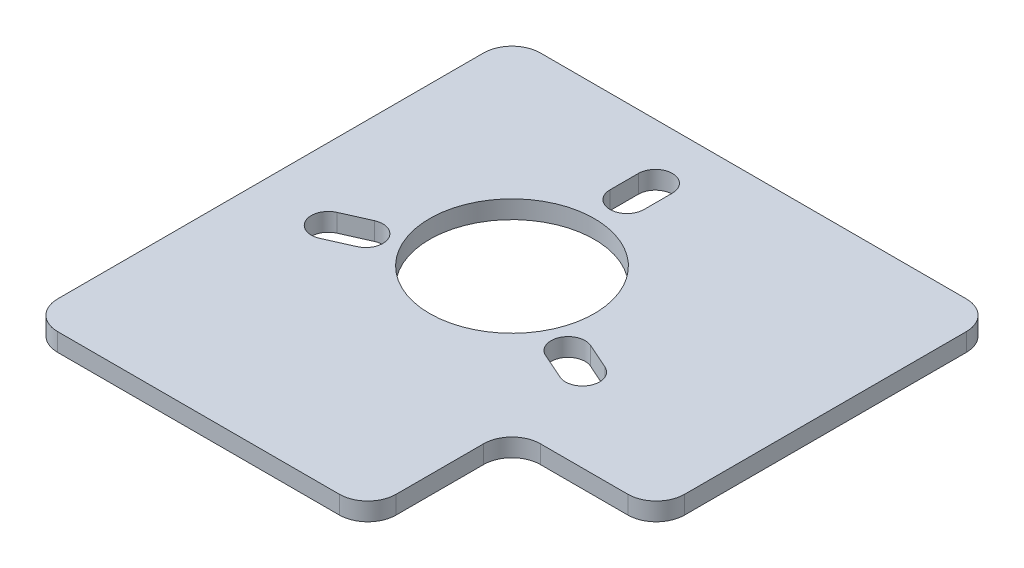
ISO-10303-21;
HEADER;
FILE_DESCRIPTION(('STEP AP214'),'2;1');
FILE_NAME('part.step','',(''),(''),'','','');
FILE_SCHEMA(('AUTOMOTIVE_DESIGN { 1 0 10303 214 1 1 1 1 }'));
ENDSEC;
DATA;
#1=APPLICATION_CONTEXT('core data for automotive mechanical design processes');
#2=APPLICATION_PROTOCOL_DEFINITION('international standard','automotive_design',2000,#1);
#3=PRODUCT_CONTEXT('',#1,'mechanical');
#4=PRODUCT('Part','Part','',(#3));
#5=PRODUCT_RELATED_PRODUCT_CATEGORY('part','',(#4));
#6=PRODUCT_DEFINITION_FORMATION('','',#4);
#7=PRODUCT_DEFINITION_CONTEXT('part definition',#1,'design');
#8=PRODUCT_DEFINITION('design','',#6,#7);
#9=PRODUCT_DEFINITION_SHAPE('','',#8);
#10=(LENGTH_UNIT() NAMED_UNIT(*) SI_UNIT(.MILLI.,.METRE.));
#11=(NAMED_UNIT(*) PLANE_ANGLE_UNIT() SI_UNIT($,.RADIAN.));
#12=(NAMED_UNIT(*) SI_UNIT($,.STERADIAN.) SOLID_ANGLE_UNIT());
#13=UNCERTAINTY_MEASURE_WITH_UNIT(LENGTH_MEASURE(1.E-05),#10,'distance_accuracy_value','');
#14=(GEOMETRIC_REPRESENTATION_CONTEXT(3) GLOBAL_UNCERTAINTY_ASSIGNED_CONTEXT((#13)) GLOBAL_UNIT_ASSIGNED_CONTEXT((#10,
#11,#12)) REPRESENTATION_CONTEXT('',''));
#15=CARTESIAN_POINT('',(0.,0.,0.));
#16=DIRECTION('',(0.,0.,1.));
#17=DIRECTION('',(1.,0.,0.));
#18=AXIS2_PLACEMENT_3D('',#15,#16,#17);
#19=CARTESIAN_POINT('',(0.,6.35,0.));
#20=DIRECTION('',(0.,-1.,0.));
#21=DIRECTION('',(0.,0.,-1.));
#22=AXIS2_PLACEMENT_3D('',#19,#20,#21);
#23=PLANE('',#22);
#24=DIRECTION('',(0.913545457642603,0.,-0.406736643075796));
#25=VECTOR('',#24,1.);
#26=CARTESIAN_POINT('',(27.6766924339672,6.35,-74.5886317434304));
#27=LINE('',#26,#25);
#28=CARTESIAN_POINT('',(27.6766924339672,6.35,-74.5886317434304));
#29=VERTEX_POINT('',#28);
#30=CARTESIAN_POINT('',(36.8121470103933,6.35,-78.6559981741884));
#31=VERTEX_POINT('',#30);
#32=EDGE_CURVE('E243',#29,#31,#27,.T.);
#33=ORIENTED_EDGE('',*,*,#32,.F.);
#34=CARTESIAN_POINT('',(25.2362725755124,6.35,-80.0699044892861));
#35=DIRECTION('',(0.,1.,0.));
#36=DIRECTION('',(0.,0.,1.));
#37=AXIS2_PLACEMENT_3D('',#34,#35,#36);
#38=CIRCLE('',#37,6.);
#39=CARTESIAN_POINT('',(22.7958527170577,6.35,-85.5511772351417));
#40=VERTEX_POINT('',#39);
#41=EDGE_CURVE('E61',#40,#29,#38,.T.);
#42=ORIENTED_EDGE('',*,*,#41,.F.);
#43=DIRECTION('',(-0.913545457642604,0.,0.406736643075794));
#44=VECTOR('',#43,1.);
#45=CARTESIAN_POINT('',(22.7958527170577,6.35,-85.5511772351417));
#46=LINE('',#45,#44);
#47=CARTESIAN_POINT('',(31.9313072934837,6.35,-89.6185436658996));
#48=VERTEX_POINT('',#47);
#49=EDGE_CURVE('E230',#48,#40,#46,.T.);
#50=ORIENTED_EDGE('',*,*,#49,.F.);
#51=CARTESIAN_POINT('',(34.3717271519385,6.35,-84.137270920044));
#52=DIRECTION('',(0.,1.,0.));
#53=DIRECTION('',(0.,0.,1.));
#54=AXIS2_PLACEMENT_3D('',#51,#52,#53);
#55=CIRCLE('',#54,6.);
#56=EDGE_CURVE('E234',#31,#48,#55,.T.);
#57=ORIENTED_EDGE('',*,*,#56,.F.);
#58=EDGE_LOOP('',(#33,#42,#50,#57));
#59=FACE_BOUND('',#58,.T.);
#60=DIRECTION('',(-0.9135454576426,0.,-0.406736643075802));
#61=VECTOR('',#60,1.);
#62=CARTESIAN_POINT('',(117.204147282942,6.35,-85.5511772351414));
#63=LINE('',#62,#61);
#64=CARTESIAN_POINT('',(117.204147282942,6.35,-85.5511772351414));
#65=VERTEX_POINT('',#64);
#66=CARTESIAN_POINT('',(108.068692706516,6.35,-89.6185436658994));
#67=VERTEX_POINT('',#66);
#68=EDGE_CURVE('E281',#65,#67,#63,.T.);
#69=ORIENTED_EDGE('',*,*,#68,.F.);
#70=CARTESIAN_POINT('',(114.763727424487,6.35,-80.0699044892857));
#71=DIRECTION('',(0.,1.,0.));
#72=DIRECTION('',(0.,0.,1.));
#73=AXIS2_PLACEMENT_3D('',#70,#71,#72);
#74=CIRCLE('',#73,6.00000000000002);
#75=CARTESIAN_POINT('',(112.323307566033,6.35,-74.5886317434301));
#76=VERTEX_POINT('',#75);
#77=EDGE_CURVE('E69',#76,#65,#74,.T.);
#78=ORIENTED_EDGE('',*,*,#77,.F.);
#79=DIRECTION('',(0.9135454576426,0.,0.406736643075802));
#80=VECTOR('',#79,1.);
#81=CARTESIAN_POINT('',(112.323307566033,6.35,-74.5886317434301));
#82=LINE('',#81,#80);
#83=CARTESIAN_POINT('',(103.187852989607,6.35,-78.6559981741882));
#84=VERTEX_POINT('',#83);
#85=EDGE_CURVE('E272',#84,#76,#82,.T.);
#86=ORIENTED_EDGE('',*,*,#85,.F.);
#87=CARTESIAN_POINT('',(105.628272848061,6.35,-84.1372709200438));
#88=DIRECTION('',(0.,1.,0.));
#89=DIRECTION('',(0.,0.,1.));
#90=AXIS2_PLACEMENT_3D('',#87,#88,#89);
#91=CIRCLE('',#90,6.00000000000002);
#92=EDGE_CURVE('E276',#67,#84,#91,.T.);
#93=ORIENTED_EDGE('',*,*,#92,.F.);
#94=EDGE_LOOP('',(#69,#78,#86,#93));
#95=FACE_BOUND('',#94,.T.);
#96=DIRECTION('',(0.,0.,1.));
#97=VECTOR('',#96,1.);
#98=CARTESIAN_POINT('',(64.,6.35,-150.5));
#99=LINE('',#98,#97);
#100=CARTESIAN_POINT('',(64.,6.35,-150.5));
#101=VERTEX_POINT('',#100);
#102=CARTESIAN_POINT('',(64.,6.35,-140.5));
#103=VERTEX_POINT('',#102);
#104=EDGE_CURVE('E324',#101,#103,#99,.T.);
#105=ORIENTED_EDGE('',*,*,#104,.F.);
#106=CARTESIAN_POINT('',(70.,6.35,-150.5));
#107=DIRECTION('',(0.,1.,0.));
#108=DIRECTION('',(0.,0.,1.));
#109=AXIS2_PLACEMENT_3D('',#106,#107,#108);
#110=CIRCLE('',#109,6.00000000000001);
#111=CARTESIAN_POINT('',(76.,6.35,-150.5));
#112=VERTEX_POINT('',#111);
#113=EDGE_CURVE('E271',#112,#101,#110,.T.);
#114=ORIENTED_EDGE('',*,*,#113,.F.);
#115=DIRECTION('',(0.,0.,-1.));
#116=VECTOR('',#115,1.);
#117=CARTESIAN_POINT('',(76.,6.35,-150.5));
#118=LINE('',#117,#116);
#119=CARTESIAN_POINT('',(76.,6.35,-140.5));
#120=VERTEX_POINT('',#119);
#121=EDGE_CURVE('E315',#120,#112,#118,.T.);
#122=ORIENTED_EDGE('',*,*,#121,.F.);
#123=CARTESIAN_POINT('',(70.,6.35,-140.5));
#124=DIRECTION('',(0.,1.,0.));
#125=DIRECTION('',(0.,0.,1.));
#126=AXIS2_PLACEMENT_3D('',#123,#124,#125);
#127=CIRCLE('',#126,6.00000000000001);
#128=EDGE_CURVE('E319',#103,#120,#127,.T.);
#129=ORIENTED_EDGE('',*,*,#128,.F.);
#130=EDGE_LOOP('',(#105,#114,#122,#129));
#131=FACE_BOUND('',#130,.T.);
#132=DIRECTION('',(0.,0.,1.));
#133=VECTOR('',#132,1.);
#134=CARTESIAN_POINT('',(0.,6.35,0.));
#135=LINE('',#134,#133);
#136=CARTESIAN_POINT('',(0.,6.35,-160.));
#137=VERTEX_POINT('',#136);
#138=CARTESIAN_POINT('',(0.,6.35,-10.));
#139=VERTEX_POINT('',#138);
#140=EDGE_CURVE('E368',#137,#139,#135,.T.);
#141=ORIENTED_EDGE('',*,*,#140,.T.);
#142=CARTESIAN_POINT('',(10.,6.35,-10.));
#143=DIRECTION('',(0.,-1.,0.));
#144=DIRECTION('',(0.,0.,-1.));
#145=AXIS2_PLACEMENT_3D('',#142,#143,#144);
#146=CIRCLE('',#145,10.);
#147=CARTESIAN_POINT('',(10.,6.35,0.));
#148=VERTEX_POINT('',#147);
#149=EDGE_CURVE('E441',#139,#148,#146,.F.);
#150=ORIENTED_EDGE('',*,*,#149,.T.);
#151=DIRECTION('',(1.,0.,0.));
#152=VECTOR('',#151,1.);
#153=CARTESIAN_POINT('',(0.,6.35,0.));
#154=LINE('',#153,#152);
#155=CARTESIAN_POINT('',(109.2,6.35,0.));
#156=VERTEX_POINT('',#155);
#157=EDGE_CURVE('E372',#148,#156,#154,.T.);
#158=ORIENTED_EDGE('',*,*,#157,.T.);
#159=CARTESIAN_POINT('',(109.2,6.35,-10.));
#160=DIRECTION('',(0.,-1.,0.));
#161=DIRECTION('',(0.,0.,-1.));
#162=AXIS2_PLACEMENT_3D('',#159,#160,#161);
#163=CIRCLE('',#162,10.);
#164=CARTESIAN_POINT('',(119.2,6.35,-10.));
#165=VERTEX_POINT('',#164);
#166=EDGE_CURVE('E438',#156,#165,#163,.F.);
#167=ORIENTED_EDGE('',*,*,#166,.T.);
#168=DIRECTION('',(0.,0.,1.));
#169=VECTOR('',#168,1.);
#170=CARTESIAN_POINT('',(119.2,6.35,0.));
#171=LINE('',#170,#169);
#172=CARTESIAN_POINT('',(119.2,6.35,-40.8));
#173=VERTEX_POINT('',#172);
#174=EDGE_CURVE('E252',#173,#165,#171,.T.);
#175=ORIENTED_EDGE('',*,*,#174,.F.);
#176=CARTESIAN_POINT('',(129.2,6.35,-40.8));
#177=DIRECTION('',(0.,-1.,0.));
#178=DIRECTION('',(0.,0.,-1.));
#179=AXIS2_PLACEMENT_3D('',#176,#177,#178);
#180=CIRCLE('',#179,10.);
#181=CARTESIAN_POINT('',(129.2,6.35,-50.8));
#182=VERTEX_POINT('',#181);
#183=EDGE_CURVE('E54',#173,#182,#180,.T.);
#184=ORIENTED_EDGE('',*,*,#183,.T.);
#185=DIRECTION('',(-1.,0.,0.));
#186=VECTOR('',#185,1.);
#187=CARTESIAN_POINT('',(119.2,6.35,-50.8));
#188=LINE('',#187,#186);
#189=CARTESIAN_POINT('',(160.,6.35,-50.8));
#190=VERTEX_POINT('',#189);
#191=EDGE_CURVE('E349',#190,#182,#188,.T.);
#192=ORIENTED_EDGE('',*,*,#191,.F.);
#193=CARTESIAN_POINT('',(160.,6.35,-60.8));
#194=DIRECTION('',(0.,-1.,0.));
#195=DIRECTION('',(0.,0.,-1.));
#196=AXIS2_PLACEMENT_3D('',#193,#194,#195);
#197=CIRCLE('',#196,10.);
#198=CARTESIAN_POINT('',(170.,6.35,-60.8));
#199=VERTEX_POINT('',#198);
#200=EDGE_CURVE('E435',#190,#199,#197,.F.);
#201=ORIENTED_EDGE('',*,*,#200,.T.);
#202=DIRECTION('',(0.,0.,-1.));
#203=VECTOR('',#202,1.);
#204=CARTESIAN_POINT('',(170.,6.35,0.));
#205=LINE('',#204,#203);
#206=CARTESIAN_POINT('',(170.,6.35,-160.));
#207=VERTEX_POINT('',#206);
#208=EDGE_CURVE('E377',#199,#207,#205,.T.);
#209=ORIENTED_EDGE('',*,*,#208,.T.);
#210=CARTESIAN_POINT('',(160.,6.35,-160.));
#211=DIRECTION('',(0.,-1.,0.));
#212=DIRECTION('',(0.,0.,-1.));
#213=AXIS2_PLACEMENT_3D('',#210,#211,#212);
#214=CIRCLE('',#213,10.);
#215=CARTESIAN_POINT('',(160.,6.35,-170.));
#216=VERTEX_POINT('',#215);
#217=EDGE_CURVE('E432',#207,#216,#214,.F.);
#218=ORIENTED_EDGE('',*,*,#217,.T.);
#219=DIRECTION('',(-1.,0.,0.));
#220=VECTOR('',#219,1.);
#221=CARTESIAN_POINT('',(0.,6.35,-170.));
#222=LINE('',#221,#220);
#223=CARTESIAN_POINT('',(10.,6.35,-170.));
#224=VERTEX_POINT('',#223);
#225=EDGE_CURVE('E381',#216,#224,#222,.T.);
#226=ORIENTED_EDGE('',*,*,#225,.T.);
#227=CARTESIAN_POINT('',(10.,6.35,-160.));
#228=DIRECTION('',(0.,-1.,0.));
#229=DIRECTION('',(0.,0.,-1.));
#230=AXIS2_PLACEMENT_3D('',#227,#228,#229);
#231=CIRCLE('',#230,10.);
#232=EDGE_CURVE('E429',#224,#137,#231,.F.);
#233=ORIENTED_EDGE('',*,*,#232,.T.);
#234=EDGE_LOOP('',(#141,#150,#158,#167,#175,#184,#192,#201,#209,#218,#226,#233));
#235=FACE_BOUND('',#234,.T.);
#236=CARTESIAN_POINT('',(70.,6.35,-100.));
#237=DIRECTION('',(0.,1.,0.));
#238=DIRECTION('',(0.,0.,1.));
#239=AXIS2_PLACEMENT_3D('',#236,#237,#238);
#240=CIRCLE('',#239,29.);
#241=CARTESIAN_POINT('',(70.,6.35,-71.));
#242=VERTEX_POINT('',#241);
#243=EDGE_CURVE('E360',#242,#242,#240,.T.);
#244=ORIENTED_EDGE('',*,*,#243,.F.);
#245=EDGE_LOOP('',(#244));
#246=FACE_BOUND('',#245,.T.);
#247=ADVANCED_FACE('F45',(#59,#95,#131,#235,#246),#23,.F.);
#248=CARTESIAN_POINT('',(0.,0.,0.));
#249=DIRECTION('',(0.,-1.,0.));
#250=DIRECTION('',(0.,0.,-1.));
#251=AXIS2_PLACEMENT_3D('',#248,#249,#250);
#252=PLANE('',#251);
#253=CARTESIAN_POINT('',(25.2362725755124,0.,-80.0699044892861));
#254=DIRECTION('',(0.,1.,0.));
#255=DIRECTION('',(0.,0.,1.));
#256=AXIS2_PLACEMENT_3D('',#253,#254,#255);
#257=CIRCLE('',#256,6.);
#258=CARTESIAN_POINT('',(22.7958527170577,0.,-85.5511772351417));
#259=VERTEX_POINT('',#258);
#260=CARTESIAN_POINT('',(27.6766924339672,0.,-74.5886317434304));
#261=VERTEX_POINT('',#260);
#262=EDGE_CURVE('E208',#259,#261,#257,.T.);
#263=ORIENTED_EDGE('',*,*,#262,.T.);
#264=DIRECTION('',(0.913545457642603,0.,-0.406736643075796));
#265=VECTOR('',#264,1.);
#266=CARTESIAN_POINT('',(27.6766924339672,0.,-74.5886317434304));
#267=LINE('',#266,#265);
#268=CARTESIAN_POINT('',(36.8121470103933,0.,-78.6559981741884));
#269=VERTEX_POINT('',#268);
#270=EDGE_CURVE('E219',#261,#269,#267,.T.);
#271=ORIENTED_EDGE('',*,*,#270,.T.);
#272=CARTESIAN_POINT('',(34.3717271519385,0.,-84.137270920044));
#273=DIRECTION('',(0.,1.,0.));
#274=DIRECTION('',(0.,0.,1.));
#275=AXIS2_PLACEMENT_3D('',#272,#273,#274);
#276=CIRCLE('',#275,6.);
#277=CARTESIAN_POINT('',(31.9313072934837,0.,-89.6185436658996));
#278=VERTEX_POINT('',#277);
#279=EDGE_CURVE('E224',#269,#278,#276,.T.);
#280=ORIENTED_EDGE('',*,*,#279,.T.);
#281=DIRECTION('',(-0.913545457642604,0.,0.406736643075794));
#282=VECTOR('',#281,1.);
#283=CARTESIAN_POINT('',(22.7958527170577,0.,-85.5511772351417));
#284=LINE('',#283,#282);
#285=EDGE_CURVE('E215',#278,#259,#284,.T.);
#286=ORIENTED_EDGE('',*,*,#285,.T.);
#287=EDGE_LOOP('',(#263,#271,#280,#286));
#288=FACE_BOUND('',#287,.T.);
#289=CARTESIAN_POINT('',(114.763727424487,0.,-80.0699044892857));
#290=DIRECTION('',(0.,1.,0.));
#291=DIRECTION('',(0.,0.,1.));
#292=AXIS2_PLACEMENT_3D('',#289,#290,#291);
#293=CIRCLE('',#292,6.00000000000002);
#294=CARTESIAN_POINT('',(112.323307566033,0.,-74.5886317434301));
#295=VERTEX_POINT('',#294);
#296=CARTESIAN_POINT('',(117.204147282942,0.,-85.5511772351414));
#297=VERTEX_POINT('',#296);
#298=EDGE_CURVE('E277',#295,#297,#293,.T.);
#299=ORIENTED_EDGE('',*,*,#298,.T.);
#300=DIRECTION('',(-0.9135454576426,0.,-0.406736643075802));
#301=VECTOR('',#300,1.);
#302=CARTESIAN_POINT('',(117.204147282942,0.,-85.5511772351414));
#303=LINE('',#302,#301);
#304=CARTESIAN_POINT('',(108.068692706516,0.,-89.6185436658994));
#305=VERTEX_POINT('',#304);
#306=EDGE_CURVE('E294',#297,#305,#303,.T.);
#307=ORIENTED_EDGE('',*,*,#306,.T.);
#308=CARTESIAN_POINT('',(105.628272848061,0.,-84.1372709200438));
#309=DIRECTION('',(0.,1.,0.));
#310=DIRECTION('',(0.,0.,1.));
#311=AXIS2_PLACEMENT_3D('',#308,#309,#310);
#312=CIRCLE('',#311,6.00000000000002);
#313=CARTESIAN_POINT('',(103.187852989607,0.,-78.6559981741882));
#314=VERTEX_POINT('',#313);
#315=EDGE_CURVE('E290',#305,#314,#312,.T.);
#316=ORIENTED_EDGE('',*,*,#315,.T.);
#317=DIRECTION('',(0.9135454576426,0.,0.406736643075802));
#318=VECTOR('',#317,1.);
#319=CARTESIAN_POINT('',(112.323307566033,0.,-74.5886317434301));
#320=LINE('',#319,#318);
#321=EDGE_CURVE('E261',#314,#295,#320,.T.);
#322=ORIENTED_EDGE('',*,*,#321,.T.);
#323=EDGE_LOOP('',(#299,#307,#316,#322));
#324=FACE_BOUND('',#323,.T.);
#325=CARTESIAN_POINT('',(70.,0.,-150.5));
#326=DIRECTION('',(0.,1.,0.));
#327=DIRECTION('',(0.,0.,1.));
#328=AXIS2_PLACEMENT_3D('',#325,#326,#327);
#329=CIRCLE('',#328,6.00000000000001);
#330=CARTESIAN_POINT('',(76.,0.,-150.5));
#331=VERTEX_POINT('',#330);
#332=CARTESIAN_POINT('',(64.,0.,-150.5));
#333=VERTEX_POINT('',#332);
#334=EDGE_CURVE('E320',#331,#333,#329,.T.);
#335=ORIENTED_EDGE('',*,*,#334,.T.);
#336=DIRECTION('',(0.,0.,1.));
#337=VECTOR('',#336,1.);
#338=CARTESIAN_POINT('',(64.,0.,-150.5));
#339=LINE('',#338,#337);
#340=CARTESIAN_POINT('',(64.,0.,-140.5));
#341=VERTEX_POINT('',#340);
#342=EDGE_CURVE('E337',#333,#341,#339,.T.);
#343=ORIENTED_EDGE('',*,*,#342,.T.);
#344=CARTESIAN_POINT('',(70.,0.,-140.5));
#345=DIRECTION('',(0.,1.,0.));
#346=DIRECTION('',(0.,0.,1.));
#347=AXIS2_PLACEMENT_3D('',#344,#345,#346);
#348=CIRCLE('',#347,6.00000000000001);
#349=CARTESIAN_POINT('',(76.,0.,-140.5));
#350=VERTEX_POINT('',#349);
#351=EDGE_CURVE('E333',#341,#350,#348,.T.);
#352=ORIENTED_EDGE('',*,*,#351,.T.);
#353=DIRECTION('',(0.,0.,-1.));
#354=VECTOR('',#353,1.);
#355=CARTESIAN_POINT('',(76.,0.,-150.5));
#356=LINE('',#355,#354);
#357=EDGE_CURVE('E305',#350,#331,#356,.T.);
#358=ORIENTED_EDGE('',*,*,#357,.T.);
#359=EDGE_LOOP('',(#335,#343,#352,#358));
#360=FACE_BOUND('',#359,.T.);
#361=DIRECTION('',(1.,0.,0.));
#362=VECTOR('',#361,1.);
#363=CARTESIAN_POINT('',(0.,0.,0.));
#364=LINE('',#363,#362);
#365=CARTESIAN_POINT('',(10.,0.,0.));
#366=VERTEX_POINT('',#365);
#367=CARTESIAN_POINT('',(109.2,0.,0.));
#368=VERTEX_POINT('',#367);
#369=EDGE_CURVE('E389',#366,#368,#364,.T.);
#370=ORIENTED_EDGE('',*,*,#369,.F.);
#371=CARTESIAN_POINT('',(10.,0.,-10.));
#372=DIRECTION('',(0.,-1.,0.));
#373=DIRECTION('',(0.,0.,-1.));
#374=AXIS2_PLACEMENT_3D('',#371,#372,#373);
#375=CIRCLE('',#374,10.);
#376=CARTESIAN_POINT('',(0.,0.,-10.));
#377=VERTEX_POINT('',#376);
#378=EDGE_CURVE('E419',#366,#377,#375,.T.);
#379=ORIENTED_EDGE('',*,*,#378,.T.);
#380=DIRECTION('',(0.,0.,1.));
#381=VECTOR('',#380,1.);
#382=CARTESIAN_POINT('',(0.,0.,0.));
#383=LINE('',#382,#381);
#384=CARTESIAN_POINT('',(0.,0.,-160.));
#385=VERTEX_POINT('',#384);
#386=EDGE_CURVE('E364',#385,#377,#383,.T.);
#387=ORIENTED_EDGE('',*,*,#386,.F.);
#388=CARTESIAN_POINT('',(10.,0.,-160.));
#389=DIRECTION('',(0.,-1.,0.));
#390=DIRECTION('',(0.,0.,-1.));
#391=AXIS2_PLACEMENT_3D('',#388,#389,#390);
#392=CIRCLE('',#391,10.);
#393=CARTESIAN_POINT('',(10.,0.,-170.));
#394=VERTEX_POINT('',#393);
#395=EDGE_CURVE('E407',#385,#394,#392,.T.);
#396=ORIENTED_EDGE('',*,*,#395,.T.);
#397=DIRECTION('',(-1.,0.,0.));
#398=VECTOR('',#397,1.);
#399=CARTESIAN_POINT('',(0.,0.,-170.));
#400=LINE('',#399,#398);
#401=CARTESIAN_POINT('',(160.,0.,-170.));
#402=VERTEX_POINT('',#401);
#403=EDGE_CURVE('E373',#402,#394,#400,.T.);
#404=ORIENTED_EDGE('',*,*,#403,.F.);
#405=CARTESIAN_POINT('',(160.,0.,-160.));
#406=DIRECTION('',(0.,-1.,0.));
#407=DIRECTION('',(0.,0.,-1.));
#408=AXIS2_PLACEMENT_3D('',#405,#406,#407);
#409=CIRCLE('',#408,10.);
#410=CARTESIAN_POINT('',(170.,0.,-160.));
#411=VERTEX_POINT('',#410);
#412=EDGE_CURVE('E410',#402,#411,#409,.T.);
#413=ORIENTED_EDGE('',*,*,#412,.T.);
#414=DIRECTION('',(0.,0.,-1.));
#415=VECTOR('',#414,1.);
#416=CARTESIAN_POINT('',(170.,0.,0.));
#417=LINE('',#416,#415);
#418=CARTESIAN_POINT('',(170.,0.,-60.8));
#419=VERTEX_POINT('',#418);
#420=EDGE_CURVE('E393',#419,#411,#417,.T.);
#421=ORIENTED_EDGE('',*,*,#420,.F.);
#422=CARTESIAN_POINT('',(160.,0.,-60.8));
#423=DIRECTION('',(0.,-1.,0.));
#424=DIRECTION('',(0.,0.,-1.));
#425=AXIS2_PLACEMENT_3D('',#422,#423,#424);
#426=CIRCLE('',#425,10.);
#427=CARTESIAN_POINT('',(160.,0.,-50.8));
#428=VERTEX_POINT('',#427);
#429=EDGE_CURVE('E413',#419,#428,#426,.T.);
#430=ORIENTED_EDGE('',*,*,#429,.T.);
#431=DIRECTION('',(-1.,0.,0.));
#432=VECTOR('',#431,1.);
#433=CARTESIAN_POINT('',(119.2,0.,-50.8));
#434=LINE('',#433,#432);
#435=CARTESIAN_POINT('',(129.2,0.,-50.8));
#436=VERTEX_POINT('',#435);
#437=EDGE_CURVE('E348',#428,#436,#434,.T.);
#438=ORIENTED_EDGE('',*,*,#437,.T.);
#439=CARTESIAN_POINT('',(129.2,0.,-40.8));
#440=DIRECTION('',(0.,-1.,0.));
#441=DIRECTION('',(0.,0.,-1.));
#442=AXIS2_PLACEMENT_3D('',#439,#440,#441);
#443=CIRCLE('',#442,10.);
#444=CARTESIAN_POINT('',(119.2,0.,-40.8));
#445=VERTEX_POINT('',#444);
#446=EDGE_CURVE('E11',#436,#445,#443,.F.);
#447=ORIENTED_EDGE('',*,*,#446,.T.);
#448=DIRECTION('',(0.,0.,1.));
#449=VECTOR('',#448,1.);
#450=CARTESIAN_POINT('',(119.2,0.,0.));
#451=LINE('',#450,#449);
#452=CARTESIAN_POINT('',(119.2,0.,-10.));
#453=VERTEX_POINT('',#452);
#454=EDGE_CURVE('E344',#445,#453,#451,.T.);
#455=ORIENTED_EDGE('',*,*,#454,.T.);
#456=CARTESIAN_POINT('',(109.2,0.,-10.));
#457=DIRECTION('',(0.,-1.,0.));
#458=DIRECTION('',(0.,0.,-1.));
#459=AXIS2_PLACEMENT_3D('',#456,#457,#458);
#460=CIRCLE('',#459,10.);
#461=EDGE_CURVE('E416',#453,#368,#460,.T.);
#462=ORIENTED_EDGE('',*,*,#461,.T.);
#463=EDGE_LOOP('',(#370,#379,#387,#396,#404,#413,#421,#430,#438,#447,#455,#462));
#464=FACE_BOUND('',#463,.T.);
#465=CARTESIAN_POINT('',(70.,0.,-100.));
#466=DIRECTION('',(0.,1.,0.));
#467=DIRECTION('',(0.,0.,1.));
#468=AXIS2_PLACEMENT_3D('',#465,#466,#467);
#469=CIRCLE('',#468,29.);
#470=CARTESIAN_POINT('',(70.,0.,-71.));
#471=VERTEX_POINT('',#470);
#472=EDGE_CURVE('E353',#471,#471,#469,.T.);
#473=ORIENTED_EDGE('',*,*,#472,.T.);
#474=EDGE_LOOP('',(#473));
#475=FACE_BOUND('',#474,.T.);
#476=ADVANCED_FACE('F226',(#288,#324,#360,#464,#475),#252,.T.);
#477=CARTESIAN_POINT('',(0.,6.35,0.));
#478=DIRECTION('',(1.,0.,0.));
#479=DIRECTION('',(0.,0.,-1.));
#480=AXIS2_PLACEMENT_3D('',#477,#478,#479);
#481=PLANE('',#480);
#482=ORIENTED_EDGE('',*,*,#386,.T.);
#483=DIRECTION('',(0.,-1.,0.));
#484=VECTOR('',#483,1.);
#485=CARTESIAN_POINT('',(0.,6.35,-10.));
#486=LINE('',#485,#484);
#487=EDGE_CURVE('E426',#377,#139,#486,.F.);
#488=ORIENTED_EDGE('',*,*,#487,.T.);
#489=ORIENTED_EDGE('',*,*,#140,.F.);
#490=DIRECTION('',(0.,-1.,0.));
#491=VECTOR('',#490,1.);
#492=CARTESIAN_POINT('',(0.,6.35,-160.));
#493=LINE('',#492,#491);
#494=EDGE_CURVE('E422',#137,#385,#493,.T.);
#495=ORIENTED_EDGE('',*,*,#494,.T.);
#496=EDGE_LOOP('',(#482,#488,#489,#495));
#497=FACE_BOUND('',#496,.T.);
#498=ADVANCED_FACE('F505',(#497),#481,.F.);
#499=CARTESIAN_POINT('',(0.,6.35,0.));
#500=DIRECTION('',(0.,0.,-1.));
#501=DIRECTION('',(-1.,0.,0.));
#502=AXIS2_PLACEMENT_3D('',#499,#500,#501);
#503=PLANE('',#502);
#504=ORIENTED_EDGE('',*,*,#157,.F.);
#505=DIRECTION('',(0.,-1.,0.));
#506=VECTOR('',#505,1.);
#507=CARTESIAN_POINT('',(10.,6.35,0.));
#508=LINE('',#507,#506);
#509=EDGE_CURVE('E403',#148,#366,#508,.T.);
#510=ORIENTED_EDGE('',*,*,#509,.T.);
#511=ORIENTED_EDGE('',*,*,#369,.T.);
#512=DIRECTION('',(0.,1.,0.));
#513=VECTOR('',#512,1.);
#514=CARTESIAN_POINT('',(109.2,6.35,0.));
#515=LINE('',#514,#513);
#516=EDGE_CURVE('E385',#368,#156,#515,.T.);
#517=ORIENTED_EDGE('',*,*,#516,.T.);
#518=EDGE_LOOP('',(#504,#510,#511,#517));
#519=FACE_BOUND('',#518,.T.);
#520=ADVANCED_FACE('F497',(#519),#503,.F.);
#521=CARTESIAN_POINT('',(170.,6.35,0.));
#522=DIRECTION('',(-1.,0.,0.));
#523=DIRECTION('',(0.,0.,1.));
#524=AXIS2_PLACEMENT_3D('',#521,#522,#523);
#525=PLANE('',#524);
#526=ORIENTED_EDGE('',*,*,#208,.F.);
#527=DIRECTION('',(0.,1.,0.));
#528=VECTOR('',#527,1.);
#529=CARTESIAN_POINT('',(170.,6.35,-60.8));
#530=LINE('',#529,#528);
#531=EDGE_CURVE('E461',#199,#419,#530,.F.);
#532=ORIENTED_EDGE('',*,*,#531,.T.);
#533=ORIENTED_EDGE('',*,*,#420,.T.);
#534=DIRECTION('',(0.,-1.,0.));
#535=VECTOR('',#534,1.);
#536=CARTESIAN_POINT('',(170.,6.35,-160.));
#537=LINE('',#536,#535);
#538=EDGE_CURVE('E458',#411,#207,#537,.F.);
#539=ORIENTED_EDGE('',*,*,#538,.T.);
#540=EDGE_LOOP('',(#526,#532,#533,#539));
#541=FACE_BOUND('',#540,.T.);
#542=ADVANCED_FACE('F524',(#541),#525,.F.);
#543=CARTESIAN_POINT('',(0.,6.35,-170.));
#544=DIRECTION('',(0.,0.,1.));
#545=DIRECTION('',(1.,0.,0.));
#546=AXIS2_PLACEMENT_3D('',#543,#544,#545);
#547=PLANE('',#546);
#548=ORIENTED_EDGE('',*,*,#225,.F.);
#549=DIRECTION('',(0.,-1.,0.));
#550=VECTOR('',#549,1.);
#551=CARTESIAN_POINT('',(160.,6.35,-170.));
#552=LINE('',#551,#550);
#553=EDGE_CURVE('E467',#216,#402,#552,.T.);
#554=ORIENTED_EDGE('',*,*,#553,.T.);
#555=ORIENTED_EDGE('',*,*,#403,.T.);
#556=DIRECTION('',(0.,-1.,0.));
#557=VECTOR('',#556,1.);
#558=CARTESIAN_POINT('',(10.,6.35,-170.));
#559=LINE('',#558,#557);
#560=EDGE_CURVE('E464',#394,#224,#559,.F.);
#561=ORIENTED_EDGE('',*,*,#560,.T.);
#562=EDGE_LOOP('',(#548,#554,#555,#561));
#563=FACE_BOUND('',#562,.T.);
#564=ADVANCED_FACE('F514',(#563),#547,.F.);
#565=CARTESIAN_POINT('',(70.,6.35,-100.));
#566=DIRECTION('',(0.,-1.,0.));
#567=DIRECTION('',(0.,0.,-1.));
#568=AXIS2_PLACEMENT_3D('',#565,#566,#567);
#569=CYLINDRICAL_SURFACE('',#568,29.);
#570=ORIENTED_EDGE('',*,*,#243,.T.);
#571=EDGE_LOOP('',(#570));
#572=FACE_BOUND('',#571,.T.);
#573=ORIENTED_EDGE('',*,*,#472,.F.);
#574=EDGE_LOOP('',(#573));
#575=FACE_BOUND('',#574,.T.);
#576=ADVANCED_FACE('F545',(#572,#575),#569,.F.);
#577=CARTESIAN_POINT('',(119.2,0.,0.));
#578=DIRECTION('',(-1.,0.,0.));
#579=DIRECTION('',(0.,0.,1.));
#580=AXIS2_PLACEMENT_3D('',#577,#578,#579);
#581=PLANE('',#580);
#582=ORIENTED_EDGE('',*,*,#454,.F.);
#583=DIRECTION('',(0.,1.,0.));
#584=VECTOR('',#583,1.);
#585=CARTESIAN_POINT('',(119.2,6.35,-40.8));
#586=LINE('',#585,#584);
#587=EDGE_CURVE('E447',#445,#173,#586,.T.);
#588=ORIENTED_EDGE('',*,*,#587,.T.);
#589=ORIENTED_EDGE('',*,*,#174,.T.);
#590=DIRECTION('',(0.,1.,0.));
#591=VECTOR('',#590,1.);
#592=CARTESIAN_POINT('',(119.2,0.,-10.));
#593=LINE('',#592,#591);
#594=EDGE_CURVE('E444',#165,#453,#593,.F.);
#595=ORIENTED_EDGE('',*,*,#594,.T.);
#596=EDGE_LOOP('',(#582,#588,#589,#595));
#597=FACE_BOUND('',#596,.T.);
#598=ADVANCED_FACE('F490',(#597),#581,.F.);
#599=CARTESIAN_POINT('',(119.2,0.,-50.8));
#600=DIRECTION('',(0.,0.,-1.));
#601=DIRECTION('',(-1.,0.,0.));
#602=AXIS2_PLACEMENT_3D('',#599,#600,#601);
#603=PLANE('',#602);
#604=ORIENTED_EDGE('',*,*,#191,.T.);
#605=DIRECTION('',(0.,1.,0.));
#606=VECTOR('',#605,1.);
#607=CARTESIAN_POINT('',(129.2,0.,-50.8));
#608=LINE('',#607,#606);
#609=EDGE_CURVE('E455',#182,#436,#608,.F.);
#610=ORIENTED_EDGE('',*,*,#609,.T.);
#611=ORIENTED_EDGE('',*,*,#437,.F.);
#612=DIRECTION('',(0.,1.,0.));
#613=VECTOR('',#612,1.);
#614=CARTESIAN_POINT('',(160.,0.,-50.8));
#615=LINE('',#614,#613);
#616=EDGE_CURVE('E451',#428,#190,#615,.T.);
#617=ORIENTED_EDGE('',*,*,#616,.T.);
#618=EDGE_LOOP('',(#604,#610,#611,#617));
#619=FACE_BOUND('',#618,.T.);
#620=ADVANCED_FACE('F479',(#619),#603,.F.);
#621=CARTESIAN_POINT('',(10.,6.35,-10.));
#622=DIRECTION('',(0.,-1.,0.));
#623=DIRECTION('',(0.,0.,-1.));
#624=AXIS2_PLACEMENT_3D('',#621,#622,#623);
#625=CYLINDRICAL_SURFACE('',#624,10.);
#626=ORIENTED_EDGE('',*,*,#149,.F.);
#627=ORIENTED_EDGE('',*,*,#487,.F.);
#628=ORIENTED_EDGE('',*,*,#378,.F.);
#629=ORIENTED_EDGE('',*,*,#509,.F.);
#630=EDGE_LOOP('',(#626,#627,#628,#629));
#631=FACE_BOUND('',#630,.T.);
#632=ADVANCED_FACE('F501',(#631),#625,.T.);
#633=CARTESIAN_POINT('',(129.2,0.,-40.8));
#634=DIRECTION('',(0.,-1.,0.));
#635=DIRECTION('',(0.,0.,-1.));
#636=AXIS2_PLACEMENT_3D('',#633,#634,#635);
#637=CYLINDRICAL_SURFACE('',#636,10.);
#638=ORIENTED_EDGE('',*,*,#446,.F.);
#639=ORIENTED_EDGE('',*,*,#609,.F.);
#640=ORIENTED_EDGE('',*,*,#183,.F.);
#641=ORIENTED_EDGE('',*,*,#587,.F.);
#642=EDGE_LOOP('',(#638,#639,#640,#641));
#643=FACE_BOUND('',#642,.T.);
#644=ADVANCED_FACE('F483',(#643),#637,.F.);
#645=CARTESIAN_POINT('',(109.2,6.35,-10.));
#646=DIRECTION('',(0.,1.,0.));
#647=DIRECTION('',(0.,0.,1.));
#648=AXIS2_PLACEMENT_3D('',#645,#646,#647);
#649=CYLINDRICAL_SURFACE('',#648,10.);
#650=ORIENTED_EDGE('',*,*,#461,.F.);
#651=ORIENTED_EDGE('',*,*,#594,.F.);
#652=ORIENTED_EDGE('',*,*,#166,.F.);
#653=ORIENTED_EDGE('',*,*,#516,.F.);
#654=EDGE_LOOP('',(#650,#651,#652,#653));
#655=FACE_BOUND('',#654,.T.);
#656=ADVANCED_FACE('F493',(#655),#649,.T.);
#657=CARTESIAN_POINT('',(160.,0.,-60.8));
#658=DIRECTION('',(0.,1.,0.));
#659=DIRECTION('',(0.,0.,1.));
#660=AXIS2_PLACEMENT_3D('',#657,#658,#659);
#661=CYLINDRICAL_SURFACE('',#660,10.);
#662=ORIENTED_EDGE('',*,*,#429,.F.);
#663=ORIENTED_EDGE('',*,*,#531,.F.);
#664=ORIENTED_EDGE('',*,*,#200,.F.);
#665=ORIENTED_EDGE('',*,*,#616,.F.);
#666=EDGE_LOOP('',(#662,#663,#664,#665));
#667=FACE_BOUND('',#666,.T.);
#668=ADVANCED_FACE('F527',(#667),#661,.T.);
#669=CARTESIAN_POINT('',(160.,6.35,-160.));
#670=DIRECTION('',(0.,-1.,0.));
#671=DIRECTION('',(0.,0.,-1.));
#672=AXIS2_PLACEMENT_3D('',#669,#670,#671);
#673=CYLINDRICAL_SURFACE('',#672,10.);
#674=ORIENTED_EDGE('',*,*,#217,.F.);
#675=ORIENTED_EDGE('',*,*,#538,.F.);
#676=ORIENTED_EDGE('',*,*,#412,.F.);
#677=ORIENTED_EDGE('',*,*,#553,.F.);
#678=EDGE_LOOP('',(#674,#675,#676,#677));
#679=FACE_BOUND('',#678,.T.);
#680=ADVANCED_FACE('F518',(#679),#673,.T.);
#681=CARTESIAN_POINT('',(10.,6.35,-160.));
#682=DIRECTION('',(0.,-1.,0.));
#683=DIRECTION('',(0.,0.,-1.));
#684=AXIS2_PLACEMENT_3D('',#681,#682,#683);
#685=CYLINDRICAL_SURFACE('',#684,10.);
#686=ORIENTED_EDGE('',*,*,#232,.F.);
#687=ORIENTED_EDGE('',*,*,#560,.F.);
#688=ORIENTED_EDGE('',*,*,#395,.F.);
#689=ORIENTED_EDGE('',*,*,#494,.F.);
#690=EDGE_LOOP('',(#686,#687,#688,#689));
#691=FACE_BOUND('',#690,.T.);
#692=ADVANCED_FACE('F47',(#691),#685,.T.);
#693=CARTESIAN_POINT('',(70.,0.,-150.5));
#694=DIRECTION('',(0.,1.,0.));
#695=DIRECTION('',(0.,0.,1.));
#696=AXIS2_PLACEMENT_3D('',#693,#694,#695);
#697=CYLINDRICAL_SURFACE('',#696,6.00000000000001);
#698=ORIENTED_EDGE('',*,*,#113,.T.);
#699=DIRECTION('',(0.,1.,0.));
#700=VECTOR('',#699,1.);
#701=CARTESIAN_POINT('',(64.,0.,-150.5));
#702=LINE('',#701,#700);
#703=EDGE_CURVE('E301',#333,#101,#702,.T.);
#704=ORIENTED_EDGE('',*,*,#703,.F.);
#705=ORIENTED_EDGE('',*,*,#334,.F.);
#706=DIRECTION('',(0.,1.,0.));
#707=VECTOR('',#706,1.);
#708=CARTESIAN_POINT('',(76.,0.,-150.5));
#709=LINE('',#708,#707);
#710=EDGE_CURVE('E312',#331,#112,#709,.T.);
#711=ORIENTED_EDGE('',*,*,#710,.T.);
#712=EDGE_LOOP('',(#698,#704,#705,#711));
#713=FACE_BOUND('',#712,.T.);
#714=ADVANCED_FACE('F588',(#713),#697,.F.);
#715=CARTESIAN_POINT('',(76.,0.,-150.5));
#716=DIRECTION('',(1.,0.,0.));
#717=DIRECTION('',(0.,0.,-1.));
#718=AXIS2_PLACEMENT_3D('',#715,#716,#717);
#719=PLANE('',#718);
#720=ORIENTED_EDGE('',*,*,#121,.T.);
#721=ORIENTED_EDGE('',*,*,#710,.F.);
#722=ORIENTED_EDGE('',*,*,#357,.F.);
#723=DIRECTION('',(0.,1.,0.));
#724=VECTOR('',#723,1.);
#725=CARTESIAN_POINT('',(76.,0.,-140.5));
#726=LINE('',#725,#724);
#727=EDGE_CURVE('E309',#350,#120,#726,.T.);
#728=ORIENTED_EDGE('',*,*,#727,.T.);
#729=EDGE_LOOP('',(#720,#721,#722,#728));
#730=FACE_BOUND('',#729,.T.);
#731=ADVANCED_FACE('F596',(#730),#719,.F.);
#732=CARTESIAN_POINT('',(70.,0.,-140.5));
#733=DIRECTION('',(0.,1.,0.));
#734=DIRECTION('',(0.,0.,1.));
#735=AXIS2_PLACEMENT_3D('',#732,#733,#734);
#736=CYLINDRICAL_SURFACE('',#735,6.00000000000001);
#737=ORIENTED_EDGE('',*,*,#128,.T.);
#738=ORIENTED_EDGE('',*,*,#727,.F.);
#739=ORIENTED_EDGE('',*,*,#351,.F.);
#740=DIRECTION('',(0.,1.,0.));
#741=VECTOR('',#740,1.);
#742=CARTESIAN_POINT('',(64.,0.,-140.5));
#743=LINE('',#742,#741);
#744=EDGE_CURVE('E306',#341,#103,#743,.T.);
#745=ORIENTED_EDGE('',*,*,#744,.T.);
#746=EDGE_LOOP('',(#737,#738,#739,#745));
#747=FACE_BOUND('',#746,.T.);
#748=ADVANCED_FACE('F606',(#747),#736,.F.);
#749=CARTESIAN_POINT('',(64.,0.,-150.5));
#750=DIRECTION('',(-1.,0.,0.));
#751=DIRECTION('',(0.,0.,1.));
#752=AXIS2_PLACEMENT_3D('',#749,#750,#751);
#753=PLANE('',#752);
#754=ORIENTED_EDGE('',*,*,#104,.T.);
#755=ORIENTED_EDGE('',*,*,#744,.F.);
#756=ORIENTED_EDGE('',*,*,#342,.F.);
#757=ORIENTED_EDGE('',*,*,#703,.T.);
#758=EDGE_LOOP('',(#754,#755,#756,#757));
#759=FACE_BOUND('',#758,.T.);
#760=ADVANCED_FACE('F616',(#759),#753,.F.);
#761=CARTESIAN_POINT('',(114.763727424487,0.,-80.0699044892857));
#762=DIRECTION('',(0.,1.,0.));
#763=DIRECTION('',(0.,0.,1.));
#764=AXIS2_PLACEMENT_3D('',#761,#762,#763);
#765=CYLINDRICAL_SURFACE('',#764,6.00000000000002);
#766=ORIENTED_EDGE('',*,*,#77,.T.);
#767=DIRECTION('',(0.,1.,0.));
#768=VECTOR('',#767,1.);
#769=CARTESIAN_POINT('',(117.204147282942,0.,-85.5511772351414));
#770=LINE('',#769,#768);
#771=EDGE_CURVE('E258',#297,#65,#770,.T.);
#772=ORIENTED_EDGE('',*,*,#771,.F.);
#773=ORIENTED_EDGE('',*,*,#298,.F.);
#774=DIRECTION('',(0.,1.,0.));
#775=VECTOR('',#774,1.);
#776=CARTESIAN_POINT('',(112.323307566033,0.,-74.5886317434301));
#777=LINE('',#776,#775);
#778=EDGE_CURVE('E268',#295,#76,#777,.T.);
#779=ORIENTED_EDGE('',*,*,#778,.T.);
#780=EDGE_LOOP('',(#766,#772,#773,#779));
#781=FACE_BOUND('',#780,.T.);
#782=ADVANCED_FACE('F626',(#781),#765,.F.);
#783=CARTESIAN_POINT('',(112.323307566033,0.,-74.5886317434301));
#784=DIRECTION('',(-0.406736643075802,0.,0.9135454576426));
#785=DIRECTION('',(0.9135454576426,0.,0.406736643075802));
#786=AXIS2_PLACEMENT_3D('',#783,#784,#785);
#787=PLANE('',#786);
#788=ORIENTED_EDGE('',*,*,#85,.T.);
#789=ORIENTED_EDGE('',*,*,#778,.F.);
#790=ORIENTED_EDGE('',*,*,#321,.F.);
#791=DIRECTION('',(0.,1.,0.));
#792=VECTOR('',#791,1.);
#793=CARTESIAN_POINT('',(103.187852989607,0.,-78.6559981741882));
#794=LINE('',#793,#792);
#795=EDGE_CURVE('E265',#314,#84,#794,.T.);
#796=ORIENTED_EDGE('',*,*,#795,.T.);
#797=EDGE_LOOP('',(#788,#789,#790,#796));
#798=FACE_BOUND('',#797,.T.);
#799=ADVANCED_FACE('F636',(#798),#787,.F.);
#800=CARTESIAN_POINT('',(105.628272848061,0.,-84.1372709200438));
#801=DIRECTION('',(0.,1.,0.));
#802=DIRECTION('',(0.,0.,1.));
#803=AXIS2_PLACEMENT_3D('',#800,#801,#802);
#804=CYLINDRICAL_SURFACE('',#803,6.00000000000002);
#805=ORIENTED_EDGE('',*,*,#92,.T.);
#806=ORIENTED_EDGE('',*,*,#795,.F.);
#807=ORIENTED_EDGE('',*,*,#315,.F.);
#808=DIRECTION('',(0.,1.,0.));
#809=VECTOR('',#808,1.);
#810=CARTESIAN_POINT('',(108.068692706516,0.,-89.6185436658994));
#811=LINE('',#810,#809);
#812=EDGE_CURVE('E262',#305,#67,#811,.T.);
#813=ORIENTED_EDGE('',*,*,#812,.T.);
#814=EDGE_LOOP('',(#805,#806,#807,#813));
#815=FACE_BOUND('',#814,.T.);
#816=ADVANCED_FACE('F645',(#815),#804,.F.);
#817=CARTESIAN_POINT('',(117.204147282942,0.,-85.5511772351414));
#818=DIRECTION('',(0.406736643075802,0.,-0.9135454576426));
#819=DIRECTION('',(-0.9135454576426,0.,-0.406736643075802));
#820=AXIS2_PLACEMENT_3D('',#817,#818,#819);
#821=PLANE('',#820);
#822=ORIENTED_EDGE('',*,*,#68,.T.);
#823=ORIENTED_EDGE('',*,*,#812,.F.);
#824=ORIENTED_EDGE('',*,*,#306,.F.);
#825=ORIENTED_EDGE('',*,*,#771,.T.);
#826=EDGE_LOOP('',(#822,#823,#824,#825));
#827=FACE_BOUND('',#826,.T.);
#828=ADVANCED_FACE('F655',(#827),#821,.F.);
#829=CARTESIAN_POINT('',(25.2362725755124,0.,-80.0699044892861));
#830=DIRECTION('',(0.,1.,0.));
#831=DIRECTION('',(0.,0.,1.));
#832=AXIS2_PLACEMENT_3D('',#829,#830,#831);
#833=CYLINDRICAL_SURFACE('',#832,6.);
#834=ORIENTED_EDGE('',*,*,#41,.T.);
#835=DIRECTION('',(0.,1.,0.));
#836=VECTOR('',#835,1.);
#837=CARTESIAN_POINT('',(27.6766924339672,0.,-74.5886317434304));
#838=LINE('',#837,#836);
#839=EDGE_CURVE('E204',#261,#29,#838,.T.);
#840=ORIENTED_EDGE('',*,*,#839,.F.);
#841=ORIENTED_EDGE('',*,*,#262,.F.);
#842=DIRECTION('',(0.,1.,0.));
#843=VECTOR('',#842,1.);
#844=CARTESIAN_POINT('',(22.7958527170577,0.,-85.5511772351417));
#845=LINE('',#844,#843);
#846=EDGE_CURVE('E249',#259,#40,#845,.T.);
#847=ORIENTED_EDGE('',*,*,#846,.T.);
#848=EDGE_LOOP('',(#834,#840,#841,#847));
#849=FACE_BOUND('',#848,.T.);
#850=ADVANCED_FACE('F206',(#849),#833,.F.);
#851=CARTESIAN_POINT('',(22.7958527170577,0.,-85.5511772351417));
#852=DIRECTION('',(-0.406736643075794,0.,-0.913545457642603));
#853=DIRECTION('',(-0.913545457642604,0.,0.406736643075794));
#854=AXIS2_PLACEMENT_3D('',#851,#852,#853);
#855=PLANE('',#854);
#856=ORIENTED_EDGE('',*,*,#49,.T.);
#857=ORIENTED_EDGE('',*,*,#846,.F.);
#858=ORIENTED_EDGE('',*,*,#285,.F.);
#859=DIRECTION('',(0.,1.,0.));
#860=VECTOR('',#859,1.);
#861=CARTESIAN_POINT('',(31.9313072934837,0.,-89.6185436658996));
#862=LINE('',#861,#860);
#863=EDGE_CURVE('E253',#278,#48,#862,.T.);
#864=ORIENTED_EDGE('',*,*,#863,.T.);
#865=EDGE_LOOP('',(#856,#857,#858,#864));
#866=FACE_BOUND('',#865,.T.);
#867=ADVANCED_FACE('F674',(#866),#855,.F.);
#868=CARTESIAN_POINT('',(34.3717271519385,0.,-84.137270920044));
#869=DIRECTION('',(0.,1.,0.));
#870=DIRECTION('',(0.,0.,1.));
#871=AXIS2_PLACEMENT_3D('',#868,#869,#870);
#872=CYLINDRICAL_SURFACE('',#871,6.);
#873=ORIENTED_EDGE('',*,*,#56,.T.);
#874=ORIENTED_EDGE('',*,*,#863,.F.);
#875=ORIENTED_EDGE('',*,*,#279,.F.);
#876=DIRECTION('',(0.,1.,0.));
#877=VECTOR('',#876,1.);
#878=CARTESIAN_POINT('',(36.8121470103933,0.,-78.6559981741884));
#879=LINE('',#878,#877);
#880=EDGE_CURVE('E214',#269,#31,#879,.T.);
#881=ORIENTED_EDGE('',*,*,#880,.T.);
#882=EDGE_LOOP('',(#873,#874,#875,#881));
#883=FACE_BOUND('',#882,.T.);
#884=ADVANCED_FACE('F683',(#883),#872,.F.);
#885=CARTESIAN_POINT('',(27.6766924339672,0.,-74.5886317434304));
#886=DIRECTION('',(0.406736643075796,0.,0.913545457642603));
#887=DIRECTION('',(0.913545457642603,0.,-0.406736643075796));
#888=AXIS2_PLACEMENT_3D('',#885,#886,#887);
#889=PLANE('',#888);
#890=ORIENTED_EDGE('',*,*,#32,.T.);
#891=ORIENTED_EDGE('',*,*,#880,.F.);
#892=ORIENTED_EDGE('',*,*,#270,.F.);
#893=ORIENTED_EDGE('',*,*,#839,.T.);
#894=EDGE_LOOP('',(#890,#891,#892,#893));
#895=FACE_BOUND('',#894,.T.);
#896=ADVANCED_FACE('F220',(#895),#889,.F.);
#897=CLOSED_SHELL('',(#247,#476,#498,#520,#542,#564,#576,#598,#620,#632,#644,#656,#668,#680,
#692,#714,#731,#748,#760,#782,#799,#816,#828,#850,#867,#884,#896));
#898=MANIFOLD_SOLID_BREP('B2',#897);
#899=ADVANCED_BREP_SHAPE_REPRESENTATION('',(#18,#898),#14);
#900=SHAPE_DEFINITION_REPRESENTATION(#9,#899);
ENDSEC;
END-ISO-10303-21;
